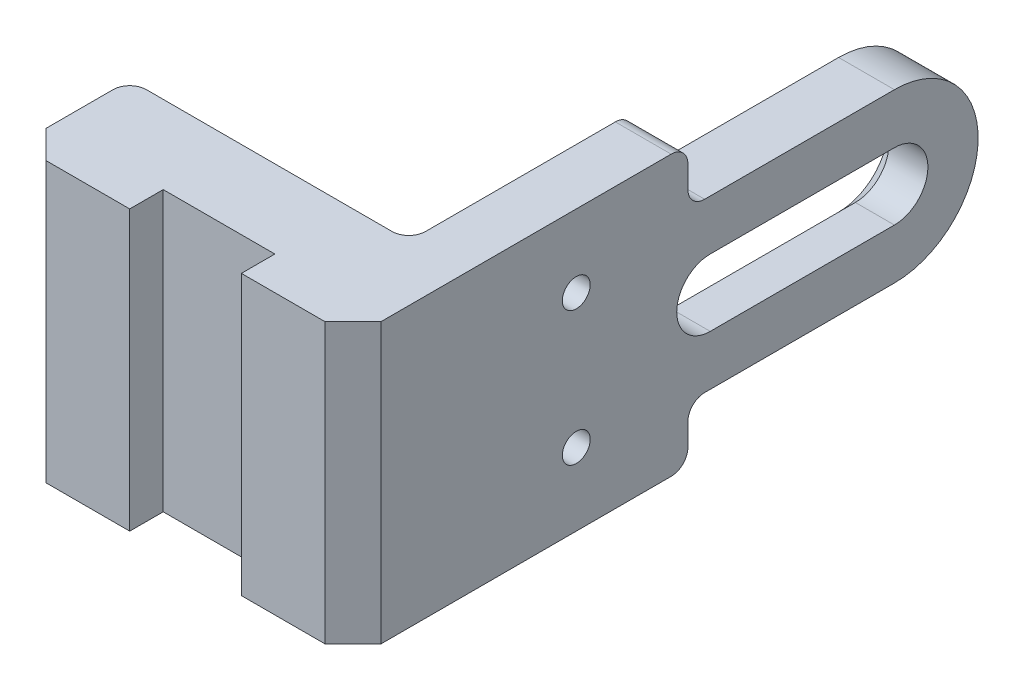
ISO-10303-21;
HEADER;
FILE_DESCRIPTION(('STEP AP214'),'2;1');
FILE_NAME('part.step','',(''),(''),'','','');
FILE_SCHEMA(('AUTOMOTIVE_DESIGN { 1 0 10303 214 1 1 1 1 }'));
ENDSEC;
DATA;
#1=APPLICATION_CONTEXT('core data for automotive mechanical design processes');
#2=APPLICATION_PROTOCOL_DEFINITION('international standard','automotive_design',2000,#1);
#3=PRODUCT_CONTEXT('',#1,'mechanical');
#4=PRODUCT('Part','Part','',(#3));
#5=PRODUCT_RELATED_PRODUCT_CATEGORY('part','',(#4));
#6=PRODUCT_DEFINITION_FORMATION('','',#4);
#7=PRODUCT_DEFINITION_CONTEXT('part definition',#1,'design');
#8=PRODUCT_DEFINITION('design','',#6,#7);
#9=PRODUCT_DEFINITION_SHAPE('','',#8);
#10=(LENGTH_UNIT() NAMED_UNIT(*) SI_UNIT(.MILLI.,.METRE.));
#11=(NAMED_UNIT(*) PLANE_ANGLE_UNIT() SI_UNIT($,.RADIAN.));
#12=(NAMED_UNIT(*) SI_UNIT($,.STERADIAN.) SOLID_ANGLE_UNIT());
#13=UNCERTAINTY_MEASURE_WITH_UNIT(LENGTH_MEASURE(1.E-05),#10,'distance_accuracy_value','');
#14=(GEOMETRIC_REPRESENTATION_CONTEXT(3) GLOBAL_UNCERTAINTY_ASSIGNED_CONTEXT((#13)) GLOBAL_UNIT_ASSIGNED_CONTEXT((#10,
#11,#12)) REPRESENTATION_CONTEXT('',''));
#15=CARTESIAN_POINT('',(0.,0.,0.));
#16=DIRECTION('',(0.,0.,1.));
#17=DIRECTION('',(1.,0.,0.));
#18=AXIS2_PLACEMENT_3D('',#15,#16,#17);
#19=CARTESIAN_POINT('',(0.,25.,0.));
#20=DIRECTION('',(0.,0.,1.));
#21=DIRECTION('',(1.,0.,0.));
#22=AXIS2_PLACEMENT_3D('',#19,#20,#21);
#23=PLANE('',#22);
#24=DIRECTION('',(-1.,0.,0.));
#25=VECTOR('',#24,1.);
#26=CARTESIAN_POINT('',(0.,0.,0.));
#27=LINE('',#26,#25);
#28=CARTESIAN_POINT('',(-2.50000000000002,0.,0.));
#29=VERTEX_POINT('',#28);
#30=CARTESIAN_POINT('',(-10.,0.,0.));
#31=VERTEX_POINT('',#30);
#32=EDGE_CURVE('E261',#29,#31,#27,.T.);
#33=ORIENTED_EDGE('',*,*,#32,.F.);
#34=DIRECTION('',(0.,1.,0.));
#35=VECTOR('',#34,1.);
#36=CARTESIAN_POINT('',(-2.50000000000002,25.,0.));
#37=LINE('',#36,#35);
#38=CARTESIAN_POINT('',(-2.50000000000002,25.,0.));
#39=VERTEX_POINT('',#38);
#40=EDGE_CURVE('E421',#29,#39,#37,.T.);
#41=ORIENTED_EDGE('',*,*,#40,.T.);
#42=DIRECTION('',(-1.,0.,0.));
#43=VECTOR('',#42,1.);
#44=CARTESIAN_POINT('',(0.,25.,0.));
#45=LINE('',#44,#43);
#46=CARTESIAN_POINT('',(-10.,25.,0.));
#47=VERTEX_POINT('',#46);
#48=EDGE_CURVE('E344',#39,#47,#45,.T.);
#49=ORIENTED_EDGE('',*,*,#48,.T.);
#50=DIRECTION('',(0.,1.,0.));
#51=VECTOR('',#50,1.);
#52=CARTESIAN_POINT('',(-10.,0.,0.));
#53=LINE('',#52,#51);
#54=EDGE_CURVE('E256',#31,#47,#53,.T.);
#55=ORIENTED_EDGE('',*,*,#54,.F.);
#56=EDGE_LOOP('',(#33,#41,#49,#55));
#57=FACE_BOUND('',#56,.T.);
#58=ADVANCED_FACE('F49',(#57),#23,.T.);
#59=CARTESIAN_POINT('',(0.,25.,0.));
#60=DIRECTION('',(0.,-1.,0.));
#61=DIRECTION('',(0.,0.,-1.));
#62=AXIS2_PLACEMENT_3D('',#59,#60,#61);
#63=PLANE('',#62);
#64=DIRECTION('',(-1.,0.,0.));
#65=VECTOR('',#64,1.);
#66=CARTESIAN_POINT('',(-5.,25.,-10.));
#67=LINE('',#66,#65);
#68=CARTESIAN_POINT('',(-6.5,25.,-10.));
#69=VERTEX_POINT('',#68);
#70=CARTESIAN_POINT('',(-28.5,25.,-10.));
#71=VERTEX_POINT('',#70);
#72=EDGE_CURVE('E350',#69,#71,#67,.T.);
#73=ORIENTED_EDGE('',*,*,#72,.T.);
#74=CARTESIAN_POINT('',(-28.5,25.,-8.5));
#75=DIRECTION('',(0.,-1.,0.));
#76=DIRECTION('',(0.,0.,-1.));
#77=AXIS2_PLACEMENT_3D('',#74,#75,#76);
#78=CIRCLE('',#77,1.5);
#79=CARTESIAN_POINT('',(-30.,25.,-8.5));
#80=VERTEX_POINT('',#79);
#81=EDGE_CURVE('E442',#71,#80,#78,.F.);
#82=ORIENTED_EDGE('',*,*,#81,.T.);
#83=DIRECTION('',(0.,0.,-1.));
#84=VECTOR('',#83,1.);
#85=CARTESIAN_POINT('',(-30.,25.,0.));
#86=LINE('',#85,#84);
#87=CARTESIAN_POINT('',(-30.,25.,-2.50000000000001));
#88=VERTEX_POINT('',#87);
#89=EDGE_CURVE('E346',#88,#80,#86,.T.);
#90=ORIENTED_EDGE('',*,*,#89,.F.);
#91=DIRECTION('',(-0.707106781186546,0.,-0.707106781186549));
#92=VECTOR('',#91,1.);
#93=CARTESIAN_POINT('',(-27.5,25.,0.));
#94=LINE('',#93,#92);
#95=CARTESIAN_POINT('',(-27.5,25.,0.));
#96=VERTEX_POINT('',#95);
#97=EDGE_CURVE('E423',#88,#96,#94,.F.);
#98=ORIENTED_EDGE('',*,*,#97,.T.);
#99=CARTESIAN_POINT('',(-20.,25.,0.));
#100=VERTEX_POINT('',#99);
#101=EDGE_CURVE('E347',#100,#96,#45,.T.);
#102=ORIENTED_EDGE('',*,*,#101,.F.);
#103=DIRECTION('',(0.,0.,1.));
#104=VECTOR('',#103,1.);
#105=CARTESIAN_POINT('',(-20.,25.,-3.));
#106=LINE('',#105,#104);
#107=CARTESIAN_POINT('',(-20.,25.,-3.));
#108=VERTEX_POINT('',#107);
#109=EDGE_CURVE('E246',#108,#100,#106,.T.);
#110=ORIENTED_EDGE('',*,*,#109,.F.);
#111=DIRECTION('',(1.,0.,0.));
#112=VECTOR('',#111,1.);
#113=CARTESIAN_POINT('',(-20.,25.,-3.));
#114=LINE('',#113,#112);
#115=CARTESIAN_POINT('',(-10.,25.,-3.));
#116=VERTEX_POINT('',#115);
#117=EDGE_CURVE('E266',#108,#116,#114,.T.);
#118=ORIENTED_EDGE('',*,*,#117,.T.);
#119=DIRECTION('',(0.,0.,1.));
#120=VECTOR('',#119,1.);
#121=CARTESIAN_POINT('',(-10.,25.,-3.));
#122=LINE('',#121,#120);
#123=EDGE_CURVE('E254',#116,#47,#122,.T.);
#124=ORIENTED_EDGE('',*,*,#123,.T.);
#125=ORIENTED_EDGE('',*,*,#48,.F.);
#126=DIRECTION('',(0.707106781186549,0.,-0.707106781186546));
#127=VECTOR('',#126,1.);
#128=CARTESIAN_POINT('',(0.,25.,-2.50000000000001));
#129=LINE('',#128,#127);
#130=CARTESIAN_POINT('',(0.,25.,-2.50000000000001));
#131=VERTEX_POINT('',#130);
#132=EDGE_CURVE('E425',#39,#131,#129,.T.);
#133=ORIENTED_EDGE('',*,*,#132,.T.);
#134=DIRECTION('',(0.,0.,-1.));
#135=VECTOR('',#134,1.);
#136=CARTESIAN_POINT('',(0.,25.,0.));
#137=LINE('',#136,#135);
#138=CARTESIAN_POINT('',(0.,25.,-28.5));
#139=VERTEX_POINT('',#138);
#140=EDGE_CURVE('E355',#131,#139,#137,.T.);
#141=ORIENTED_EDGE('',*,*,#140,.T.);
#142=DIRECTION('',(-1.,0.,0.));
#143=VECTOR('',#142,1.);
#144=CARTESIAN_POINT('',(0.,25.,-28.5));
#145=LINE('',#144,#143);
#146=CARTESIAN_POINT('',(-5.,25.,-28.5));
#147=VERTEX_POINT('',#146);
#148=EDGE_CURVE('E403',#139,#147,#145,.T.);
#149=ORIENTED_EDGE('',*,*,#148,.T.);
#150=DIRECTION('',(0.,0.,-1.));
#151=VECTOR('',#150,1.);
#152=CARTESIAN_POINT('',(-5.,25.,-10.));
#153=LINE('',#152,#151);
#154=CARTESIAN_POINT('',(-5.,25.,-11.5));
#155=VERTEX_POINT('',#154);
#156=EDGE_CURVE('E353',#155,#147,#153,.T.);
#157=ORIENTED_EDGE('',*,*,#156,.F.);
#158=CARTESIAN_POINT('',(-6.5,25.,-11.5));
#159=DIRECTION('',(0.,-1.,0.));
#160=DIRECTION('',(0.,0.,-1.));
#161=AXIS2_PLACEMENT_3D('',#158,#159,#160);
#162=CIRCLE('',#161,1.5);
#163=EDGE_CURVE('E448',#155,#69,#162,.T.);
#164=ORIENTED_EDGE('',*,*,#163,.T.);
#165=EDGE_LOOP('',(#73,#82,#90,#98,#102,#110,#118,#124,#125,#133,#141,#149,#157,#164));
#166=FACE_BOUND('',#165,.T.);
#167=ADVANCED_FACE('F516',(#166),#63,.F.);
#168=CARTESIAN_POINT('',(0.,0.,0.));
#169=DIRECTION('',(0.,-1.,0.));
#170=DIRECTION('',(0.,0.,-1.));
#171=AXIS2_PLACEMENT_3D('',#168,#169,#170);
#172=PLANE('',#171);
#173=DIRECTION('',(0.,0.,-1.));
#174=VECTOR('',#173,1.);
#175=CARTESIAN_POINT('',(-30.,0.,0.));
#176=LINE('',#175,#174);
#177=CARTESIAN_POINT('',(-30.,0.,-2.50000000000001));
#178=VERTEX_POINT('',#177);
#179=CARTESIAN_POINT('',(-30.,0.,-8.5));
#180=VERTEX_POINT('',#179);
#181=EDGE_CURVE('E359',#178,#180,#176,.T.);
#182=ORIENTED_EDGE('',*,*,#181,.T.);
#183=CARTESIAN_POINT('',(-28.5,0.,-8.5));
#184=DIRECTION('',(0.,-1.,0.));
#185=DIRECTION('',(0.,0.,-1.));
#186=AXIS2_PLACEMENT_3D('',#183,#184,#185);
#187=CIRCLE('',#186,1.5);
#188=CARTESIAN_POINT('',(-28.5,0.,-10.));
#189=VERTEX_POINT('',#188);
#190=EDGE_CURVE('E435',#180,#189,#187,.T.);
#191=ORIENTED_EDGE('',*,*,#190,.T.);
#192=DIRECTION('',(-1.,0.,0.));
#193=VECTOR('',#192,1.);
#194=CARTESIAN_POINT('',(-5.,0.,-10.));
#195=LINE('',#194,#193);
#196=CARTESIAN_POINT('',(-6.5,0.,-10.));
#197=VERTEX_POINT('',#196);
#198=EDGE_CURVE('E361',#197,#189,#195,.T.);
#199=ORIENTED_EDGE('',*,*,#198,.F.);
#200=CARTESIAN_POINT('',(-6.5,0.,-11.5));
#201=DIRECTION('',(0.,-1.,0.));
#202=DIRECTION('',(0.,0.,-1.));
#203=AXIS2_PLACEMENT_3D('',#200,#201,#202);
#204=CIRCLE('',#203,1.5);
#205=CARTESIAN_POINT('',(-5.,0.,-11.5));
#206=VERTEX_POINT('',#205);
#207=EDGE_CURVE('E446',#197,#206,#204,.F.);
#208=ORIENTED_EDGE('',*,*,#207,.T.);
#209=DIRECTION('',(0.,0.,-1.));
#210=VECTOR('',#209,1.);
#211=CARTESIAN_POINT('',(-5.,0.,-10.));
#212=LINE('',#211,#210);
#213=CARTESIAN_POINT('',(-5.,0.,-28.5));
#214=VERTEX_POINT('',#213);
#215=EDGE_CURVE('E364',#206,#214,#212,.T.);
#216=ORIENTED_EDGE('',*,*,#215,.T.);
#217=DIRECTION('',(-1.,0.,0.));
#218=VECTOR('',#217,1.);
#219=CARTESIAN_POINT('',(0.,0.,-28.5));
#220=LINE('',#219,#218);
#221=CARTESIAN_POINT('',(0.,0.,-28.5));
#222=VERTEX_POINT('',#221);
#223=EDGE_CURVE('E395',#214,#222,#220,.F.);
#224=ORIENTED_EDGE('',*,*,#223,.T.);
#225=DIRECTION('',(0.,0.,-1.));
#226=VECTOR('',#225,1.);
#227=CARTESIAN_POINT('',(0.,0.,0.));
#228=LINE('',#227,#226);
#229=CARTESIAN_POINT('',(0.,0.,-2.50000000000001));
#230=VERTEX_POINT('',#229);
#231=EDGE_CURVE('E366',#230,#222,#228,.T.);
#232=ORIENTED_EDGE('',*,*,#231,.F.);
#233=DIRECTION('',(-0.707106781186549,0.,0.707106781186546));
#234=VECTOR('',#233,1.);
#235=CARTESIAN_POINT('',(-1.25,0.,-1.25000000000001));
#236=LINE('',#235,#234);
#237=EDGE_CURVE('E419',#230,#29,#236,.T.);
#238=ORIENTED_EDGE('',*,*,#237,.T.);
#239=ORIENTED_EDGE('',*,*,#32,.T.);
#240=DIRECTION('',(0.,0.,1.));
#241=VECTOR('',#240,1.);
#242=CARTESIAN_POINT('',(-10.,0.,-3.));
#243=LINE('',#242,#241);
#244=CARTESIAN_POINT('',(-10.,0.,-3.));
#245=VERTEX_POINT('',#244);
#246=EDGE_CURVE('E245',#245,#31,#243,.T.);
#247=ORIENTED_EDGE('',*,*,#246,.F.);
#248=DIRECTION('',(1.,0.,0.));
#249=VECTOR('',#248,1.);
#250=CARTESIAN_POINT('',(-20.,0.,-3.));
#251=LINE('',#250,#249);
#252=CARTESIAN_POINT('',(-20.,0.,-3.));
#253=VERTEX_POINT('',#252);
#254=EDGE_CURVE('E234',#253,#245,#251,.T.);
#255=ORIENTED_EDGE('',*,*,#254,.F.);
#256=DIRECTION('',(0.,0.,1.));
#257=VECTOR('',#256,1.);
#258=CARTESIAN_POINT('',(-20.,0.,-3.));
#259=LINE('',#258,#257);
#260=CARTESIAN_POINT('',(-20.,0.,0.));
#261=VERTEX_POINT('',#260);
#262=EDGE_CURVE('E262',#253,#261,#259,.T.);
#263=ORIENTED_EDGE('',*,*,#262,.T.);
#264=CARTESIAN_POINT('',(-27.5,0.,0.));
#265=VERTEX_POINT('',#264);
#266=EDGE_CURVE('E343',#261,#265,#27,.T.);
#267=ORIENTED_EDGE('',*,*,#266,.T.);
#268=DIRECTION('',(0.707106781186546,0.,0.707106781186549));
#269=VECTOR('',#268,1.);
#270=CARTESIAN_POINT('',(-13.7500000000001,0.,13.75));
#271=LINE('',#270,#269);
#272=EDGE_CURVE('E417',#265,#178,#271,.F.);
#273=ORIENTED_EDGE('',*,*,#272,.T.);
#274=EDGE_LOOP('',(#182,#191,#199,#208,#216,#224,#232,#238,#239,#247,#255,#263,#267,#273));
#275=FACE_BOUND('',#274,.T.);
#276=ADVANCED_FACE('F259',(#275),#172,.T.);
#277=CARTESIAN_POINT('',(0.,25.,0.));
#278=DIRECTION('',(-1.,0.,0.));
#279=DIRECTION('',(0.,0.,1.));
#280=AXIS2_PLACEMENT_3D('',#277,#278,#279);
#281=PLANE('',#280);
#282=CARTESIAN_POINT('',(0.,18.5,-20.));
#283=DIRECTION('',(1.,0.,0.));
#284=DIRECTION('',(0.,0.,-1.));
#285=AXIS2_PLACEMENT_3D('',#282,#283,#284);
#286=CIRCLE('',#285,1.25);
#287=CARTESIAN_POINT('',(0.,18.5,-21.25));
#288=VERTEX_POINT('',#287);
#289=EDGE_CURVE('E293',#288,#288,#286,.T.);
#290=ORIENTED_EDGE('',*,*,#289,.F.);
#291=EDGE_LOOP('',(#290));
#292=FACE_BOUND('',#291,.T.);
#293=CARTESIAN_POINT('',(0.,6.5,-20.));
#294=DIRECTION('',(1.,0.,0.));
#295=DIRECTION('',(0.,0.,-1.));
#296=AXIS2_PLACEMENT_3D('',#293,#294,#295);
#297=CIRCLE('',#296,1.25);
#298=CARTESIAN_POINT('',(0.,6.5,-21.25));
#299=VERTEX_POINT('',#298);
#300=EDGE_CURVE('E283',#299,#299,#297,.T.);
#301=ORIENTED_EDGE('',*,*,#300,.F.);
#302=EDGE_LOOP('',(#301));
#303=FACE_BOUND('',#302,.T.);
#304=DIRECTION('',(0.,0.,-1.));
#305=VECTOR('',#304,1.);
#306=CARTESIAN_POINT('',(0.,9.5,-32.));
#307=LINE('',#306,#305);
#308=CARTESIAN_POINT('',(0.,9.5,-32.));
#309=VERTEX_POINT('',#308);
#310=CARTESIAN_POINT('',(0.,9.5,-48.5));
#311=VERTEX_POINT('',#310);
#312=EDGE_CURVE('E301',#309,#311,#307,.T.);
#313=ORIENTED_EDGE('',*,*,#312,.F.);
#314=CARTESIAN_POINT('',(0.,12.5,-32.));
#315=DIRECTION('',(1.,0.,0.));
#316=DIRECTION('',(0.,0.,-1.));
#317=AXIS2_PLACEMENT_3D('',#314,#315,#316);
#318=CIRCLE('',#317,3.);
#319=CARTESIAN_POINT('',(0.,15.5,-32.));
#320=VERTEX_POINT('',#319);
#321=EDGE_CURVE('E296',#320,#309,#318,.T.);
#322=ORIENTED_EDGE('',*,*,#321,.F.);
#323=DIRECTION('',(0.,0.,-1.));
#324=VECTOR('',#323,1.);
#325=CARTESIAN_POINT('',(0.,15.5,-32.));
#326=LINE('',#325,#324);
#327=CARTESIAN_POINT('',(0.,15.5,-48.5));
#328=VERTEX_POINT('',#327);
#329=EDGE_CURVE('E307',#320,#328,#326,.T.);
#330=ORIENTED_EDGE('',*,*,#329,.T.);
#331=CARTESIAN_POINT('',(0.,12.5,-48.5));
#332=DIRECTION('',(1.,0.,0.));
#333=DIRECTION('',(0.,0.,-1.));
#334=AXIS2_PLACEMENT_3D('',#331,#332,#333);
#335=CIRCLE('',#334,3.);
#336=EDGE_CURVE('E304',#311,#328,#335,.T.);
#337=ORIENTED_EDGE('',*,*,#336,.F.);
#338=EDGE_LOOP('',(#313,#322,#330,#337));
#339=FACE_BOUND('',#338,.T.);
#340=ORIENTED_EDGE('',*,*,#140,.F.);
#341=DIRECTION('',(0.,-1.,0.));
#342=VECTOR('',#341,1.);
#343=CARTESIAN_POINT('',(0.,0.,-2.50000000000001));
#344=LINE('',#343,#342);
#345=EDGE_CURVE('E414',#131,#230,#344,.T.);
#346=ORIENTED_EDGE('',*,*,#345,.T.);
#347=ORIENTED_EDGE('',*,*,#231,.T.);
#348=CARTESIAN_POINT('',(0.,1.5,-28.5));
#349=DIRECTION('',(-1.,0.,0.));
#350=DIRECTION('',(0.,0.,1.));
#351=AXIS2_PLACEMENT_3D('',#348,#349,#350);
#352=CIRCLE('',#351,1.5);
#353=CARTESIAN_POINT('',(0.,1.5,-30.));
#354=VERTEX_POINT('',#353);
#355=EDGE_CURVE('E401',#222,#354,#352,.F.);
#356=ORIENTED_EDGE('',*,*,#355,.T.);
#357=DIRECTION('',(0.,-1.,0.));
#358=VECTOR('',#357,1.);
#359=CARTESIAN_POINT('',(0.,0.,-30.));
#360=LINE('',#359,#358);
#361=CARTESIAN_POINT('',(0.,3.5,-30.));
#362=VERTEX_POINT('',#361);
#363=EDGE_CURVE('E320',#362,#354,#360,.T.);
#364=ORIENTED_EDGE('',*,*,#363,.F.);
#365=CARTESIAN_POINT('',(0.,3.5,-31.5));
#366=DIRECTION('',(-1.,0.,0.));
#367=DIRECTION('',(0.,0.,1.));
#368=AXIS2_PLACEMENT_3D('',#365,#366,#367);
#369=CIRCLE('',#368,1.5);
#370=CARTESIAN_POINT('',(0.,5.,-31.5));
#371=VERTEX_POINT('',#370);
#372=EDGE_CURVE('E410',#362,#371,#369,.T.);
#373=ORIENTED_EDGE('',*,*,#372,.T.);
#374=DIRECTION('',(0.,0.,-1.));
#375=VECTOR('',#374,1.);
#376=CARTESIAN_POINT('',(0.,5.,0.));
#377=LINE('',#376,#375);
#378=CARTESIAN_POINT('',(0.,5.,-48.5));
#379=VERTEX_POINT('',#378);
#380=EDGE_CURVE('E313',#371,#379,#377,.T.);
#381=ORIENTED_EDGE('',*,*,#380,.T.);
#382=CARTESIAN_POINT('',(0.,12.5,-48.5));
#383=DIRECTION('',(1.,0.,0.));
#384=DIRECTION('',(0.,0.,-1.));
#385=AXIS2_PLACEMENT_3D('',#382,#383,#384);
#386=CIRCLE('',#385,7.5);
#387=CARTESIAN_POINT('',(0.,20.,-48.5));
#388=VERTEX_POINT('',#387);
#389=EDGE_CURVE('E334',#379,#388,#386,.T.);
#390=ORIENTED_EDGE('',*,*,#389,.T.);
#391=DIRECTION('',(0.,0.,-1.));
#392=VECTOR('',#391,1.);
#393=CARTESIAN_POINT('',(0.,20.,0.));
#394=LINE('',#393,#392);
#395=CARTESIAN_POINT('',(0.,20.,-31.5));
#396=VERTEX_POINT('',#395);
#397=EDGE_CURVE('E332',#396,#388,#394,.T.);
#398=ORIENTED_EDGE('',*,*,#397,.F.);
#399=CARTESIAN_POINT('',(0.,21.5,-31.5));
#400=DIRECTION('',(-1.,0.,0.));
#401=DIRECTION('',(0.,0.,1.));
#402=AXIS2_PLACEMENT_3D('',#399,#400,#401);
#403=CIRCLE('',#402,1.5);
#404=CARTESIAN_POINT('',(0.,21.5,-30.));
#405=VERTEX_POINT('',#404);
#406=EDGE_CURVE('E406',#396,#405,#403,.T.);
#407=ORIENTED_EDGE('',*,*,#406,.T.);
#408=DIRECTION('',(0.,-1.,0.));
#409=VECTOR('',#408,1.);
#410=CARTESIAN_POINT('',(0.,0.,-30.));
#411=LINE('',#410,#409);
#412=CARTESIAN_POINT('',(0.,23.5,-30.));
#413=VERTEX_POINT('',#412);
#414=EDGE_CURVE('E329',#413,#405,#411,.T.);
#415=ORIENTED_EDGE('',*,*,#414,.F.);
#416=CARTESIAN_POINT('',(0.,23.5,-28.5));
#417=DIRECTION('',(-1.,0.,0.));
#418=DIRECTION('',(0.,0.,1.));
#419=AXIS2_PLACEMENT_3D('',#416,#417,#418);
#420=CIRCLE('',#419,1.5);
#421=EDGE_CURVE('E398',#413,#139,#420,.F.);
#422=ORIENTED_EDGE('',*,*,#421,.T.);
#423=EDGE_LOOP('',(#340,#346,#347,#356,#364,#373,#381,#390,#398,#407,#415,#422));
#424=FACE_BOUND('',#423,.T.);
#425=ADVANCED_FACE('F500',(#292,#303,#339,#424),#281,.F.);
#426=CARTESIAN_POINT('',(-5.,25.,-10.));
#427=DIRECTION('',(-1.,0.,0.));
#428=DIRECTION('',(0.,0.,1.));
#429=AXIS2_PLACEMENT_3D('',#426,#427,#428);
#430=PLANE('',#429);
#431=CARTESIAN_POINT('',(-5.,12.5,-32.));
#432=DIRECTION('',(-1.,0.,0.));
#433=DIRECTION('',(0.,0.,1.));
#434=AXIS2_PLACEMENT_3D('',#431,#432,#433);
#435=CIRCLE('',#434,4.5);
#436=CARTESIAN_POINT('',(-5.,17.,-32.));
#437=VERTEX_POINT('',#436);
#438=CARTESIAN_POINT('',(-5.,8.,-32.));
#439=VERTEX_POINT('',#438);
#440=EDGE_CURVE('E455',#437,#439,#435,.F.);
#441=ORIENTED_EDGE('',*,*,#440,.T.);
#442=DIRECTION('',(0.,0.,-1.));
#443=VECTOR('',#442,1.);
#444=CARTESIAN_POINT('',(-5.,8.,-48.5));
#445=LINE('',#444,#443);
#446=CARTESIAN_POINT('',(-5.,8.,-48.5));
#447=VERTEX_POINT('',#446);
#448=EDGE_CURVE('E459',#439,#447,#445,.T.);
#449=ORIENTED_EDGE('',*,*,#448,.T.);
#450=CARTESIAN_POINT('',(-5.,12.5,-48.5));
#451=DIRECTION('',(-1.,0.,0.));
#452=DIRECTION('',(0.,0.,1.));
#453=AXIS2_PLACEMENT_3D('',#450,#451,#452);
#454=CIRCLE('',#453,4.5);
#455=CARTESIAN_POINT('',(-5.,17.,-48.5));
#456=VERTEX_POINT('',#455);
#457=EDGE_CURVE('E457',#447,#456,#454,.F.);
#458=ORIENTED_EDGE('',*,*,#457,.T.);
#459=DIRECTION('',(0.,0.,1.));
#460=VECTOR('',#459,1.);
#461=CARTESIAN_POINT('',(-5.,17.,-10.));
#462=LINE('',#461,#460);
#463=EDGE_CURVE('E453',#456,#437,#462,.T.);
#464=ORIENTED_EDGE('',*,*,#463,.T.);
#465=EDGE_LOOP('',(#441,#449,#458,#464));
#466=FACE_BOUND('',#465,.T.);
#467=CARTESIAN_POINT('',(-5.,18.5,-20.));
#468=DIRECTION('',(1.,0.,0.));
#469=DIRECTION('',(0.,0.,-1.));
#470=AXIS2_PLACEMENT_3D('',#467,#468,#469);
#471=CIRCLE('',#470,3.);
#472=CARTESIAN_POINT('',(-5.,18.5,-23.));
#473=VERTEX_POINT('',#472);
#474=EDGE_CURVE('E280',#473,#473,#471,.T.);
#475=ORIENTED_EDGE('',*,*,#474,.T.);
#476=EDGE_LOOP('',(#475));
#477=FACE_BOUND('',#476,.T.);
#478=CARTESIAN_POINT('',(-5.,6.5,-20.));
#479=DIRECTION('',(1.,0.,0.));
#480=DIRECTION('',(0.,0.,-1.));
#481=AXIS2_PLACEMENT_3D('',#478,#479,#480);
#482=CIRCLE('',#481,3.);
#483=CARTESIAN_POINT('',(-5.,6.5,-23.));
#484=VERTEX_POINT('',#483);
#485=EDGE_CURVE('E279',#484,#484,#482,.T.);
#486=ORIENTED_EDGE('',*,*,#485,.T.);
#487=EDGE_LOOP('',(#486));
#488=FACE_BOUND('',#487,.T.);
#489=ORIENTED_EDGE('',*,*,#215,.F.);
#490=DIRECTION('',(0.,-1.,0.));
#491=VECTOR('',#490,1.);
#492=CARTESIAN_POINT('',(-5.,25.,-11.5));
#493=LINE('',#492,#491);
#494=EDGE_CURVE('E444',#206,#155,#493,.F.);
#495=ORIENTED_EDGE('',*,*,#494,.T.);
#496=ORIENTED_EDGE('',*,*,#156,.T.);
#497=CARTESIAN_POINT('',(-5.,23.5,-28.5));
#498=DIRECTION('',(-1.,0.,0.));
#499=DIRECTION('',(0.,0.,1.));
#500=AXIS2_PLACEMENT_3D('',#497,#498,#499);
#501=CIRCLE('',#500,1.5);
#502=CARTESIAN_POINT('',(-5.,23.5,-30.));
#503=VERTEX_POINT('',#502);
#504=EDGE_CURVE('E390',#147,#503,#501,.T.);
#505=ORIENTED_EDGE('',*,*,#504,.T.);
#506=DIRECTION('',(0.,1.,0.));
#507=VECTOR('',#506,1.);
#508=CARTESIAN_POINT('',(-5.,25.,-30.));
#509=LINE('',#508,#507);
#510=CARTESIAN_POINT('',(-5.,21.5,-30.));
#511=VERTEX_POINT('',#510);
#512=EDGE_CURVE('E340',#511,#503,#509,.T.);
#513=ORIENTED_EDGE('',*,*,#512,.F.);
#514=CARTESIAN_POINT('',(-5.,21.5,-31.5));
#515=DIRECTION('',(-1.,0.,0.));
#516=DIRECTION('',(0.,0.,1.));
#517=AXIS2_PLACEMENT_3D('',#514,#515,#516);
#518=CIRCLE('',#517,1.5);
#519=CARTESIAN_POINT('',(-5.,20.,-31.5));
#520=VERTEX_POINT('',#519);
#521=EDGE_CURVE('E408',#511,#520,#518,.F.);
#522=ORIENTED_EDGE('',*,*,#521,.T.);
#523=DIRECTION('',(0.,0.,1.));
#524=VECTOR('',#523,1.);
#525=CARTESIAN_POINT('',(-5.,20.,-10.));
#526=LINE('',#525,#524);
#527=CARTESIAN_POINT('',(-5.,20.,-48.5));
#528=VERTEX_POINT('',#527);
#529=EDGE_CURVE('E357',#528,#520,#526,.T.);
#530=ORIENTED_EDGE('',*,*,#529,.F.);
#531=CARTESIAN_POINT('',(-5.,12.5,-48.5));
#532=DIRECTION('',(-1.,0.,0.));
#533=DIRECTION('',(0.,0.,1.));
#534=AXIS2_PLACEMENT_3D('',#531,#532,#533);
#535=CIRCLE('',#534,7.5);
#536=CARTESIAN_POINT('',(-5.,5.,-48.5));
#537=VERTEX_POINT('',#536);
#538=EDGE_CURVE('E370',#528,#537,#535,.T.);
#539=ORIENTED_EDGE('',*,*,#538,.T.);
#540=DIRECTION('',(0.,0.,1.));
#541=VECTOR('',#540,1.);
#542=CARTESIAN_POINT('',(-5.,5.,-10.));
#543=LINE('',#542,#541);
#544=CARTESIAN_POINT('',(-5.,5.,-31.5));
#545=VERTEX_POINT('',#544);
#546=EDGE_CURVE('E372',#537,#545,#543,.T.);
#547=ORIENTED_EDGE('',*,*,#546,.T.);
#548=CARTESIAN_POINT('',(-5.,3.5,-31.5));
#549=DIRECTION('',(-1.,0.,0.));
#550=DIRECTION('',(0.,0.,1.));
#551=AXIS2_PLACEMENT_3D('',#548,#549,#550);
#552=CIRCLE('',#551,1.5);
#553=CARTESIAN_POINT('',(-5.,3.5,-30.));
#554=VERTEX_POINT('',#553);
#555=EDGE_CURVE('E412',#545,#554,#552,.F.);
#556=ORIENTED_EDGE('',*,*,#555,.T.);
#557=DIRECTION('',(0.,1.,0.));
#558=VECTOR('',#557,1.);
#559=CARTESIAN_POINT('',(-5.,25.,-30.));
#560=LINE('',#559,#558);
#561=CARTESIAN_POINT('',(-5.,1.5,-30.));
#562=VERTEX_POINT('',#561);
#563=EDGE_CURVE('E326',#562,#554,#560,.T.);
#564=ORIENTED_EDGE('',*,*,#563,.F.);
#565=CARTESIAN_POINT('',(-5.,1.5,-28.5));
#566=DIRECTION('',(-1.,0.,0.));
#567=DIRECTION('',(0.,0.,1.));
#568=AXIS2_PLACEMENT_3D('',#565,#566,#567);
#569=CIRCLE('',#568,1.5);
#570=EDGE_CURVE('E392',#562,#214,#569,.T.);
#571=ORIENTED_EDGE('',*,*,#570,.T.);
#572=EDGE_LOOP('',(#489,#495,#496,#505,#513,#522,#530,#539,#547,#556,#564,#571));
#573=FACE_BOUND('',#572,.T.);
#574=ADVANCED_FACE('F483',(#466,#477,#488,#573),#430,.T.);
#575=ORIENTED_EDGE('',*,*,#101,.T.);
#576=DIRECTION('',(0.,-1.,0.));
#577=VECTOR('',#576,1.);
#578=CARTESIAN_POINT('',(-27.5,25.,0.));
#579=LINE('',#578,#577);
#580=EDGE_CURVE('E427',#96,#265,#579,.T.);
#581=ORIENTED_EDGE('',*,*,#580,.T.);
#582=ORIENTED_EDGE('',*,*,#266,.F.);
#583=DIRECTION('',(0.,1.,0.));
#584=VECTOR('',#583,1.);
#585=CARTESIAN_POINT('',(-20.,0.,0.));
#586=LINE('',#585,#584);
#587=EDGE_CURVE('E271',#261,#100,#586,.T.);
#588=ORIENTED_EDGE('',*,*,#587,.T.);
#589=EDGE_LOOP('',(#575,#581,#582,#588));
#590=FACE_BOUND('',#589,.T.);
#591=ADVANCED_FACE('F519',(#590),#23,.T.);
#592=CARTESIAN_POINT('',(-5.,25.,-10.));
#593=DIRECTION('',(0.,0.,1.));
#594=DIRECTION('',(1.,0.,0.));
#595=AXIS2_PLACEMENT_3D('',#592,#593,#594);
#596=PLANE('',#595);
#597=ORIENTED_EDGE('',*,*,#198,.T.);
#598=DIRECTION('',(0.,-1.,0.));
#599=VECTOR('',#598,1.);
#600=CARTESIAN_POINT('',(-28.5,25.,-10.));
#601=LINE('',#600,#599);
#602=EDGE_CURVE('E440',#189,#71,#601,.F.);
#603=ORIENTED_EDGE('',*,*,#602,.T.);
#604=ORIENTED_EDGE('',*,*,#72,.F.);
#605=DIRECTION('',(0.,-1.,0.));
#606=VECTOR('',#605,1.);
#607=CARTESIAN_POINT('',(-6.5,25.,-10.));
#608=LINE('',#607,#606);
#609=EDGE_CURVE('E437',#69,#197,#608,.T.);
#610=ORIENTED_EDGE('',*,*,#609,.T.);
#611=EDGE_LOOP('',(#597,#603,#604,#610));
#612=FACE_BOUND('',#611,.T.);
#613=ADVANCED_FACE('F528',(#612),#596,.F.);
#614=CARTESIAN_POINT('',(-30.,25.,0.));
#615=DIRECTION('',(-1.,0.,0.));
#616=DIRECTION('',(0.,0.,1.));
#617=AXIS2_PLACEMENT_3D('',#614,#615,#616);
#618=PLANE('',#617);
#619=ORIENTED_EDGE('',*,*,#89,.T.);
#620=DIRECTION('',(0.,-1.,0.));
#621=VECTOR('',#620,1.);
#622=CARTESIAN_POINT('',(-30.,0.,-8.5));
#623=LINE('',#622,#621);
#624=EDGE_CURVE('E432',#80,#180,#623,.T.);
#625=ORIENTED_EDGE('',*,*,#624,.T.);
#626=ORIENTED_EDGE('',*,*,#181,.F.);
#627=DIRECTION('',(0.,1.,0.));
#628=VECTOR('',#627,1.);
#629=CARTESIAN_POINT('',(-30.,25.,-2.50000000000001));
#630=LINE('',#629,#628);
#631=EDGE_CURVE('E430',#178,#88,#630,.T.);
#632=ORIENTED_EDGE('',*,*,#631,.T.);
#633=EDGE_LOOP('',(#619,#625,#626,#632));
#634=FACE_BOUND('',#633,.T.);
#635=ADVANCED_FACE('F534',(#634),#618,.T.);
#636=CARTESIAN_POINT('',(-25.,12.5,-48.5));
#637=DIRECTION('',(1.,0.,0.));
#638=DIRECTION('',(0.,0.,-1.));
#639=AXIS2_PLACEMENT_3D('',#636,#637,#638);
#640=CYLINDRICAL_SURFACE('',#639,7.5);
#641=DIRECTION('',(1.,0.,0.));
#642=VECTOR('',#641,1.);
#643=CARTESIAN_POINT('',(-25.,20.,-48.5));
#644=LINE('',#643,#642);
#645=EDGE_CURVE('E337',#528,#388,#644,.T.);
#646=ORIENTED_EDGE('',*,*,#645,.T.);
#647=ORIENTED_EDGE('',*,*,#389,.F.);
#648=DIRECTION('',(1.,0.,0.));
#649=VECTOR('',#648,1.);
#650=CARTESIAN_POINT('',(-25.,5.,-48.5));
#651=LINE('',#650,#649);
#652=EDGE_CURVE('E323',#537,#379,#651,.T.);
#653=ORIENTED_EDGE('',*,*,#652,.F.);
#654=ORIENTED_EDGE('',*,*,#538,.F.);
#655=EDGE_LOOP('',(#646,#647,#653,#654));
#656=FACE_BOUND('',#655,.T.);
#657=ADVANCED_FACE('F635',(#656),#640,.T.);
#658=CARTESIAN_POINT('',(-25.,20.,0.));
#659=DIRECTION('',(0.,-1.,0.));
#660=DIRECTION('',(0.,0.,-1.));
#661=AXIS2_PLACEMENT_3D('',#658,#659,#660);
#662=PLANE('',#661);
#663=ORIENTED_EDGE('',*,*,#529,.T.);
#664=DIRECTION('',(1.,0.,0.));
#665=VECTOR('',#664,1.);
#666=CARTESIAN_POINT('',(0.,20.,-31.5));
#667=LINE('',#666,#665);
#668=EDGE_CURVE('E375',#520,#396,#667,.T.);
#669=ORIENTED_EDGE('',*,*,#668,.T.);
#670=ORIENTED_EDGE('',*,*,#397,.T.);
#671=ORIENTED_EDGE('',*,*,#645,.F.);
#672=EDGE_LOOP('',(#663,#669,#670,#671));
#673=FACE_BOUND('',#672,.T.);
#674=ADVANCED_FACE('F639',(#673),#662,.F.);
#675=CARTESIAN_POINT('',(-25.,0.,-30.));
#676=DIRECTION('',(0.,0.,1.));
#677=DIRECTION('',(1.,0.,0.));
#678=AXIS2_PLACEMENT_3D('',#675,#676,#677);
#679=PLANE('',#678);
#680=ORIENTED_EDGE('',*,*,#414,.T.);
#681=DIRECTION('',(1.,0.,0.));
#682=VECTOR('',#681,1.);
#683=CARTESIAN_POINT('',(-5.,21.5,-30.));
#684=LINE('',#683,#682);
#685=EDGE_CURVE('E380',#405,#511,#684,.F.);
#686=ORIENTED_EDGE('',*,*,#685,.T.);
#687=ORIENTED_EDGE('',*,*,#512,.T.);
#688=DIRECTION('',(-1.,0.,0.));
#689=VECTOR('',#688,1.);
#690=CARTESIAN_POINT('',(-25.,23.5,-30.));
#691=LINE('',#690,#689);
#692=EDGE_CURVE('E378',#503,#413,#691,.F.);
#693=ORIENTED_EDGE('',*,*,#692,.T.);
#694=EDGE_LOOP('',(#680,#686,#687,#693));
#695=FACE_BOUND('',#694,.T.);
#696=ADVANCED_FACE('F645',(#695),#679,.F.);
#697=CARTESIAN_POINT('',(-25.,0.,-30.));
#698=DIRECTION('',(0.,0.,1.));
#699=DIRECTION('',(1.,0.,0.));
#700=AXIS2_PLACEMENT_3D('',#697,#698,#699);
#701=PLANE('',#700);
#702=ORIENTED_EDGE('',*,*,#563,.T.);
#703=DIRECTION('',(1.,0.,0.));
#704=VECTOR('',#703,1.);
#705=CARTESIAN_POINT('',(-25.,3.5,-30.));
#706=LINE('',#705,#704);
#707=EDGE_CURVE('E385',#554,#362,#706,.T.);
#708=ORIENTED_EDGE('',*,*,#707,.T.);
#709=ORIENTED_EDGE('',*,*,#363,.T.);
#710=DIRECTION('',(-1.,0.,0.));
#711=VECTOR('',#710,1.);
#712=CARTESIAN_POINT('',(-5.,1.5,-30.));
#713=LINE('',#712,#711);
#714=EDGE_CURVE('E382',#354,#562,#713,.T.);
#715=ORIENTED_EDGE('',*,*,#714,.T.);
#716=EDGE_LOOP('',(#702,#708,#709,#715));
#717=FACE_BOUND('',#716,.T.);
#718=ADVANCED_FACE('F652',(#717),#701,.F.);
#719=CARTESIAN_POINT('',(-25.,5.,0.));
#720=DIRECTION('',(0.,-1.,0.));
#721=DIRECTION('',(0.,0.,-1.));
#722=AXIS2_PLACEMENT_3D('',#719,#720,#721);
#723=PLANE('',#722);
#724=ORIENTED_EDGE('',*,*,#380,.F.);
#725=DIRECTION('',(1.,0.,0.));
#726=VECTOR('',#725,1.);
#727=CARTESIAN_POINT('',(-25.,5.,-31.5));
#728=LINE('',#727,#726);
#729=EDGE_CURVE('E388',#371,#545,#728,.F.);
#730=ORIENTED_EDGE('',*,*,#729,.T.);
#731=ORIENTED_EDGE('',*,*,#546,.F.);
#732=ORIENTED_EDGE('',*,*,#652,.T.);
#733=EDGE_LOOP('',(#724,#730,#731,#732));
#734=FACE_BOUND('',#733,.T.);
#735=ADVANCED_FACE('F512',(#734),#723,.T.);
#736=CARTESIAN_POINT('',(-25.,12.5,-32.));
#737=DIRECTION('',(1.,0.,0.));
#738=DIRECTION('',(0.,0.,-1.));
#739=AXIS2_PLACEMENT_3D('',#736,#737,#738);
#740=CYLINDRICAL_SURFACE('',#739,3.);
#741=DIRECTION('',(1.,0.,0.));
#742=VECTOR('',#741,1.);
#743=CARTESIAN_POINT('',(-25.,9.5,-32.));
#744=LINE('',#743,#742);
#745=CARTESIAN_POINT('',(-3.49999999999999,9.5,-32.));
#746=VERTEX_POINT('',#745);
#747=EDGE_CURVE('E310',#746,#309,#744,.T.);
#748=ORIENTED_EDGE('',*,*,#747,.F.);
#749=CARTESIAN_POINT('',(-3.49999999999999,12.5,-32.));
#750=DIRECTION('',(-1.,0.,0.));
#751=DIRECTION('',(0.,0.,1.));
#752=AXIS2_PLACEMENT_3D('',#749,#750,#751);
#753=CIRCLE('',#752,3.);
#754=CARTESIAN_POINT('',(-3.49999999999999,15.5,-32.));
#755=VERTEX_POINT('',#754);
#756=EDGE_CURVE('E58',#746,#755,#753,.T.);
#757=ORIENTED_EDGE('',*,*,#756,.T.);
#758=DIRECTION('',(1.,0.,0.));
#759=VECTOR('',#758,1.);
#760=CARTESIAN_POINT('',(-25.,15.5,-32.));
#761=LINE('',#760,#759);
#762=EDGE_CURVE('E311',#755,#320,#761,.T.);
#763=ORIENTED_EDGE('',*,*,#762,.T.);
#764=ORIENTED_EDGE('',*,*,#321,.T.);
#765=EDGE_LOOP('',(#748,#757,#763,#764));
#766=FACE_BOUND('',#765,.T.);
#767=ADVANCED_FACE('F494',(#766),#740,.F.);
#768=CARTESIAN_POINT('',(-25.,15.5,-32.));
#769=DIRECTION('',(0.,-1.,0.));
#770=DIRECTION('',(0.,0.,-1.));
#771=AXIS2_PLACEMENT_3D('',#768,#769,#770);
#772=PLANE('',#771);
#773=ORIENTED_EDGE('',*,*,#762,.F.);
#774=DIRECTION('',(0.,0.,-1.));
#775=VECTOR('',#774,1.);
#776=CARTESIAN_POINT('',(-3.49999999999999,15.5,-32.));
#777=LINE('',#776,#775);
#778=CARTESIAN_POINT('',(-3.49999999999999,15.5,-48.5));
#779=VERTEX_POINT('',#778);
#780=EDGE_CURVE('E13',#755,#779,#777,.T.);
#781=ORIENTED_EDGE('',*,*,#780,.T.);
#782=DIRECTION('',(1.,0.,0.));
#783=VECTOR('',#782,1.);
#784=CARTESIAN_POINT('',(-25.,15.5,-48.5));
#785=LINE('',#784,#783);
#786=EDGE_CURVE('E314',#779,#328,#785,.T.);
#787=ORIENTED_EDGE('',*,*,#786,.T.);
#788=ORIENTED_EDGE('',*,*,#329,.F.);
#789=EDGE_LOOP('',(#773,#781,#787,#788));
#790=FACE_BOUND('',#789,.T.);
#791=ADVANCED_FACE('F504',(#790),#772,.T.);
#792=CARTESIAN_POINT('',(-25.,12.5,-48.5));
#793=DIRECTION('',(1.,0.,0.));
#794=DIRECTION('',(0.,0.,-1.));
#795=AXIS2_PLACEMENT_3D('',#792,#793,#794);
#796=CYLINDRICAL_SURFACE('',#795,3.);
#797=ORIENTED_EDGE('',*,*,#786,.F.);
#798=CARTESIAN_POINT('',(-3.49999999999999,12.5,-48.5));
#799=DIRECTION('',(-1.,0.,0.));
#800=DIRECTION('',(0.,0.,1.));
#801=AXIS2_PLACEMENT_3D('',#798,#799,#800);
#802=CIRCLE('',#801,3.);
#803=CARTESIAN_POINT('',(-3.49999999999999,9.5,-48.5));
#804=VERTEX_POINT('',#803);
#805=EDGE_CURVE('E462',#779,#804,#802,.T.);
#806=ORIENTED_EDGE('',*,*,#805,.T.);
#807=DIRECTION('',(1.,0.,0.));
#808=VECTOR('',#807,1.);
#809=CARTESIAN_POINT('',(-25.,9.5,-48.5));
#810=LINE('',#809,#808);
#811=EDGE_CURVE('E316',#804,#311,#810,.T.);
#812=ORIENTED_EDGE('',*,*,#811,.T.);
#813=ORIENTED_EDGE('',*,*,#336,.T.);
#814=EDGE_LOOP('',(#797,#806,#812,#813));
#815=FACE_BOUND('',#814,.T.);
#816=ADVANCED_FACE('F503',(#815),#796,.F.);
#817=CARTESIAN_POINT('',(-25.,9.5,-32.));
#818=DIRECTION('',(0.,-1.,0.));
#819=DIRECTION('',(0.,0.,-1.));
#820=AXIS2_PLACEMENT_3D('',#817,#818,#819);
#821=PLANE('',#820);
#822=ORIENTED_EDGE('',*,*,#811,.F.);
#823=DIRECTION('',(0.,0.,1.));
#824=VECTOR('',#823,1.);
#825=CARTESIAN_POINT('',(-3.49999999999999,9.5,-32.));
#826=LINE('',#825,#824);
#827=EDGE_CURVE('E450',#804,#746,#826,.T.);
#828=ORIENTED_EDGE('',*,*,#827,.T.);
#829=ORIENTED_EDGE('',*,*,#747,.T.);
#830=ORIENTED_EDGE('',*,*,#312,.T.);
#831=EDGE_LOOP('',(#822,#828,#829,#830));
#832=FACE_BOUND('',#831,.T.);
#833=ADVANCED_FACE('F493',(#832),#821,.F.);
#834=CARTESIAN_POINT('',(-25.,21.5,-31.5));
#835=DIRECTION('',(-1.,0.,0.));
#836=DIRECTION('',(0.,0.,1.));
#837=AXIS2_PLACEMENT_3D('',#834,#835,#836);
#838=CYLINDRICAL_SURFACE('',#837,1.5);
#839=ORIENTED_EDGE('',*,*,#521,.F.);
#840=ORIENTED_EDGE('',*,*,#685,.F.);
#841=ORIENTED_EDGE('',*,*,#406,.F.);
#842=ORIENTED_EDGE('',*,*,#668,.F.);
#843=EDGE_LOOP('',(#839,#840,#841,#842));
#844=FACE_BOUND('',#843,.T.);
#845=ADVANCED_FACE('F665',(#844),#838,.F.);
#846=CARTESIAN_POINT('',(-25.,3.5,-31.5));
#847=DIRECTION('',(1.,0.,0.));
#848=DIRECTION('',(0.,0.,-1.));
#849=AXIS2_PLACEMENT_3D('',#846,#847,#848);
#850=CYLINDRICAL_SURFACE('',#849,1.5);
#851=ORIENTED_EDGE('',*,*,#555,.F.);
#852=ORIENTED_EDGE('',*,*,#729,.F.);
#853=ORIENTED_EDGE('',*,*,#372,.F.);
#854=ORIENTED_EDGE('',*,*,#707,.F.);
#855=EDGE_LOOP('',(#851,#852,#853,#854));
#856=FACE_BOUND('',#855,.T.);
#857=ADVANCED_FACE('F678',(#856),#850,.F.);
#858=CARTESIAN_POINT('',(-25.,1.5,-28.5));
#859=DIRECTION('',(1.,0.,0.));
#860=DIRECTION('',(0.,0.,-1.));
#861=AXIS2_PLACEMENT_3D('',#858,#859,#860);
#862=CYLINDRICAL_SURFACE('',#861,1.5);
#863=ORIENTED_EDGE('',*,*,#355,.F.);
#864=ORIENTED_EDGE('',*,*,#223,.F.);
#865=ORIENTED_EDGE('',*,*,#570,.F.);
#866=ORIENTED_EDGE('',*,*,#714,.F.);
#867=EDGE_LOOP('',(#863,#864,#865,#866));
#868=FACE_BOUND('',#867,.T.);
#869=ADVANCED_FACE('F571',(#868),#862,.T.);
#870=CARTESIAN_POINT('',(0.,23.5,-28.5));
#871=DIRECTION('',(-1.,0.,0.));
#872=DIRECTION('',(0.,0.,1.));
#873=AXIS2_PLACEMENT_3D('',#870,#871,#872);
#874=CYLINDRICAL_SURFACE('',#873,1.5);
#875=ORIENTED_EDGE('',*,*,#421,.F.);
#876=ORIENTED_EDGE('',*,*,#692,.F.);
#877=ORIENTED_EDGE('',*,*,#504,.F.);
#878=ORIENTED_EDGE('',*,*,#148,.F.);
#879=EDGE_LOOP('',(#875,#876,#877,#878));
#880=FACE_BOUND('',#879,.T.);
#881=ADVANCED_FACE('F615',(#880),#874,.T.);
#882=CARTESIAN_POINT('',(-25.,6.5,-20.));
#883=DIRECTION('',(1.,0.,0.));
#884=DIRECTION('',(0.,0.,-1.));
#885=AXIS2_PLACEMENT_3D('',#882,#883,#884);
#886=CYLINDRICAL_SURFACE('',#885,1.25);
#887=CARTESIAN_POINT('',(-2.5,6.5,-20.));
#888=DIRECTION('',(1.,0.,0.));
#889=DIRECTION('',(0.,0.,-1.));
#890=AXIS2_PLACEMENT_3D('',#887,#888,#889);
#891=CIRCLE('',#890,1.25);
#892=CARTESIAN_POINT('',(-2.5,6.5,-21.25));
#893=VERTEX_POINT('',#892);
#894=EDGE_CURVE('E255',#893,#893,#891,.T.);
#895=ORIENTED_EDGE('',*,*,#894,.F.);
#896=EDGE_LOOP('',(#895));
#897=FACE_BOUND('',#896,.T.);
#898=ORIENTED_EDGE('',*,*,#300,.T.);
#899=EDGE_LOOP('',(#898));
#900=FACE_BOUND('',#899,.T.);
#901=ADVANCED_FACE('F612',(#897,#900),#886,.F.);
#902=CARTESIAN_POINT('',(-25.,18.5,-20.));
#903=DIRECTION('',(1.,0.,0.));
#904=DIRECTION('',(0.,0.,-1.));
#905=AXIS2_PLACEMENT_3D('',#902,#903,#904);
#906=CYLINDRICAL_SURFACE('',#905,1.25);
#907=CARTESIAN_POINT('',(-2.5,18.5,-20.));
#908=DIRECTION('',(1.,0.,0.));
#909=DIRECTION('',(0.,0.,-1.));
#910=AXIS2_PLACEMENT_3D('',#907,#908,#909);
#911=CIRCLE('',#910,1.25);
#912=CARTESIAN_POINT('',(-2.5,18.5,-21.25));
#913=VERTEX_POINT('',#912);
#914=EDGE_CURVE('E275',#913,#913,#911,.T.);
#915=ORIENTED_EDGE('',*,*,#914,.F.);
#916=EDGE_LOOP('',(#915));
#917=FACE_BOUND('',#916,.T.);
#918=ORIENTED_EDGE('',*,*,#289,.T.);
#919=EDGE_LOOP('',(#918));
#920=FACE_BOUND('',#919,.T.);
#921=ADVANCED_FACE('F603',(#917,#920),#906,.F.);
#922=CARTESIAN_POINT('',(-5.,18.5,-20.));
#923=DIRECTION('',(1.,0.,0.));
#924=DIRECTION('',(0.,0.,-1.));
#925=AXIS2_PLACEMENT_3D('',#922,#923,#924);
#926=CYLINDRICAL_SURFACE('',#925,3.);
#927=ORIENTED_EDGE('',*,*,#474,.F.);
#928=EDGE_LOOP('',(#927));
#929=FACE_BOUND('',#928,.T.);
#930=CARTESIAN_POINT('',(-2.5,18.5,-20.));
#931=DIRECTION('',(1.,0.,0.));
#932=DIRECTION('',(0.,0.,-1.));
#933=AXIS2_PLACEMENT_3D('',#930,#931,#932);
#934=CIRCLE('',#933,3.);
#935=CARTESIAN_POINT('',(-2.5,18.5,-23.));
#936=VERTEX_POINT('',#935);
#937=EDGE_CURVE('E278',#936,#936,#934,.T.);
#938=ORIENTED_EDGE('',*,*,#937,.T.);
#939=EDGE_LOOP('',(#938));
#940=FACE_BOUND('',#939,.T.);
#941=ADVANCED_FACE('F599',(#929,#940),#926,.F.);
#942=CARTESIAN_POINT('',(-2.5,18.5,-20.));
#943=DIRECTION('',(1.,0.,0.));
#944=DIRECTION('',(0.,0.,-1.));
#945=AXIS2_PLACEMENT_3D('',#942,#943,#944);
#946=PLANE('',#945);
#947=ORIENTED_EDGE('',*,*,#914,.T.);
#948=EDGE_LOOP('',(#947));
#949=FACE_BOUND('',#948,.T.);
#950=ORIENTED_EDGE('',*,*,#937,.F.);
#951=EDGE_LOOP('',(#950));
#952=FACE_BOUND('',#951,.T.);
#953=ADVANCED_FACE('F595',(#949,#952),#946,.F.);
#954=CARTESIAN_POINT('',(-5.,6.5,-20.));
#955=DIRECTION('',(1.,0.,0.));
#956=DIRECTION('',(0.,0.,-1.));
#957=AXIS2_PLACEMENT_3D('',#954,#955,#956);
#958=CYLINDRICAL_SURFACE('',#957,3.);
#959=ORIENTED_EDGE('',*,*,#485,.F.);
#960=EDGE_LOOP('',(#959));
#961=FACE_BOUND('',#960,.T.);
#962=CARTESIAN_POINT('',(-2.5,6.5,-20.));
#963=DIRECTION('',(1.,0.,0.));
#964=DIRECTION('',(0.,0.,-1.));
#965=AXIS2_PLACEMENT_3D('',#962,#963,#964);
#966=CIRCLE('',#965,3.);
#967=CARTESIAN_POINT('',(-2.5,6.5,-23.));
#968=VERTEX_POINT('',#967);
#969=EDGE_CURVE('E288',#968,#968,#966,.T.);
#970=ORIENTED_EDGE('',*,*,#969,.T.);
#971=EDGE_LOOP('',(#970));
#972=FACE_BOUND('',#971,.T.);
#973=ADVANCED_FACE('F598',(#961,#972),#958,.F.);
#974=CARTESIAN_POINT('',(-2.5,6.5,-20.));
#975=DIRECTION('',(1.,0.,0.));
#976=DIRECTION('',(0.,0.,-1.));
#977=AXIS2_PLACEMENT_3D('',#974,#975,#976);
#978=PLANE('',#977);
#979=ORIENTED_EDGE('',*,*,#894,.T.);
#980=EDGE_LOOP('',(#979));
#981=FACE_BOUND('',#980,.T.);
#982=ORIENTED_EDGE('',*,*,#969,.F.);
#983=EDGE_LOOP('',(#982));
#984=FACE_BOUND('',#983,.T.);
#985=ADVANCED_FACE('F594',(#981,#984),#978,.F.);
#986=CARTESIAN_POINT('',(-20.,0.,-3.));
#987=DIRECTION('',(0.,0.,1.));
#988=DIRECTION('',(1.,0.,0.));
#989=AXIS2_PLACEMENT_3D('',#986,#987,#988);
#990=PLANE('',#989);
#991=ORIENTED_EDGE('',*,*,#117,.F.);
#992=DIRECTION('',(0.,1.,0.));
#993=VECTOR('',#992,1.);
#994=CARTESIAN_POINT('',(-20.,0.,-3.));
#995=LINE('',#994,#993);
#996=EDGE_CURVE('E240',#253,#108,#995,.T.);
#997=ORIENTED_EDGE('',*,*,#996,.F.);
#998=ORIENTED_EDGE('',*,*,#254,.T.);
#999=DIRECTION('',(0.,1.,0.));
#1000=VECTOR('',#999,1.);
#1001=CARTESIAN_POINT('',(-10.,0.,-3.));
#1002=LINE('',#1001,#1000);
#1003=EDGE_CURVE('E238',#245,#116,#1002,.T.);
#1004=ORIENTED_EDGE('',*,*,#1003,.T.);
#1005=EDGE_LOOP('',(#991,#997,#998,#1004));
#1006=FACE_BOUND('',#1005,.T.);
#1007=ADVANCED_FACE('F237',(#1006),#990,.T.);
#1008=CARTESIAN_POINT('',(-10.,0.,-3.));
#1009=DIRECTION('',(-1.,0.,0.));
#1010=DIRECTION('',(0.,0.,1.));
#1011=AXIS2_PLACEMENT_3D('',#1008,#1009,#1010);
#1012=PLANE('',#1011);
#1013=ORIENTED_EDGE('',*,*,#123,.F.);
#1014=ORIENTED_EDGE('',*,*,#1003,.F.);
#1015=ORIENTED_EDGE('',*,*,#246,.T.);
#1016=ORIENTED_EDGE('',*,*,#54,.T.);
#1017=EDGE_LOOP('',(#1013,#1014,#1015,#1016));
#1018=FACE_BOUND('',#1017,.T.);
#1019=ADVANCED_FACE('F250',(#1018),#1012,.T.);
#1020=CARTESIAN_POINT('',(-20.,0.,-3.));
#1021=DIRECTION('',(-1.,0.,0.));
#1022=DIRECTION('',(0.,0.,1.));
#1023=AXIS2_PLACEMENT_3D('',#1020,#1021,#1022);
#1024=PLANE('',#1023);
#1025=ORIENTED_EDGE('',*,*,#109,.T.);
#1026=ORIENTED_EDGE('',*,*,#587,.F.);
#1027=ORIENTED_EDGE('',*,*,#262,.F.);
#1028=ORIENTED_EDGE('',*,*,#996,.T.);
#1029=EDGE_LOOP('',(#1025,#1026,#1027,#1028));
#1030=FACE_BOUND('',#1029,.T.);
#1031=ADVANCED_FACE('F582',(#1030),#1024,.F.);
#1032=CARTESIAN_POINT('',(0.,25.,-2.50000000000001));
#1033=DIRECTION('',(0.707106781186546,0.,0.707106781186549));
#1034=DIRECTION('',(0.,1.,0.));
#1035=AXIS2_PLACEMENT_3D('',#1032,#1033,#1034);
#1036=PLANE('',#1035);
#1037=ORIENTED_EDGE('',*,*,#132,.F.);
#1038=ORIENTED_EDGE('',*,*,#40,.F.);
#1039=ORIENTED_EDGE('',*,*,#237,.F.);
#1040=ORIENTED_EDGE('',*,*,#345,.F.);
#1041=EDGE_LOOP('',(#1037,#1038,#1039,#1040));
#1042=FACE_BOUND('',#1041,.T.);
#1043=ADVANCED_FACE('F578',(#1042),#1036,.T.);
#1044=CARTESIAN_POINT('',(-27.5,25.,0.));
#1045=DIRECTION('',(0.707106781186549,0.,-0.707106781186546));
#1046=DIRECTION('',(0.,-1.,0.));
#1047=AXIS2_PLACEMENT_3D('',#1044,#1045,#1046);
#1048=PLANE('',#1047);
#1049=ORIENTED_EDGE('',*,*,#97,.F.);
#1050=ORIENTED_EDGE('',*,*,#631,.F.);
#1051=ORIENTED_EDGE('',*,*,#272,.F.);
#1052=ORIENTED_EDGE('',*,*,#580,.F.);
#1053=EDGE_LOOP('',(#1049,#1050,#1051,#1052));
#1054=FACE_BOUND('',#1053,.T.);
#1055=ADVANCED_FACE('F546',(#1054),#1048,.F.);
#1056=CARTESIAN_POINT('',(-28.5,25.,-8.5));
#1057=DIRECTION('',(0.,1.,0.));
#1058=DIRECTION('',(0.,0.,1.));
#1059=AXIS2_PLACEMENT_3D('',#1056,#1057,#1058);
#1060=CYLINDRICAL_SURFACE('',#1059,1.5);
#1061=ORIENTED_EDGE('',*,*,#81,.F.);
#1062=ORIENTED_EDGE('',*,*,#602,.F.);
#1063=ORIENTED_EDGE('',*,*,#190,.F.);
#1064=ORIENTED_EDGE('',*,*,#624,.F.);
#1065=EDGE_LOOP('',(#1061,#1062,#1063,#1064));
#1066=FACE_BOUND('',#1065,.T.);
#1067=ADVANCED_FACE('F554',(#1066),#1060,.T.);
#1068=CARTESIAN_POINT('',(-6.5,25.,-11.5));
#1069=DIRECTION('',(0.,-1.,0.));
#1070=DIRECTION('',(0.,0.,-1.));
#1071=AXIS2_PLACEMENT_3D('',#1068,#1069,#1070);
#1072=CYLINDRICAL_SURFACE('',#1071,1.5);
#1073=ORIENTED_EDGE('',*,*,#163,.F.);
#1074=ORIENTED_EDGE('',*,*,#494,.F.);
#1075=ORIENTED_EDGE('',*,*,#207,.F.);
#1076=ORIENTED_EDGE('',*,*,#609,.F.);
#1077=EDGE_LOOP('',(#1073,#1074,#1075,#1076));
#1078=FACE_BOUND('',#1077,.T.);
#1079=ADVANCED_FACE('F561',(#1078),#1072,.F.);
#1080=CARTESIAN_POINT('',(-5.,17.,-10.));
#1081=DIRECTION('',(0.707106781186545,0.70710678118655,0.));
#1082=DIRECTION('',(0.,0.,1.));
#1083=AXIS2_PLACEMENT_3D('',#1080,#1081,#1082);
#1084=PLANE('',#1083);
#1085=DIRECTION('',(0.70710678118655,-0.707106781186545,0.));
#1086=VECTOR('',#1085,1.);
#1087=CARTESIAN_POINT('',(-5.,17.,-32.));
#1088=LINE('',#1087,#1086);
#1089=EDGE_CURVE('E468',#437,#755,#1088,.T.);
#1090=ORIENTED_EDGE('',*,*,#1089,.F.);
#1091=ORIENTED_EDGE('',*,*,#463,.F.);
#1092=DIRECTION('',(-0.70710678118655,0.707106781186545,0.));
#1093=VECTOR('',#1092,1.);
#1094=CARTESIAN_POINT('',(-3.49999999999999,15.5,-48.5));
#1095=LINE('',#1094,#1093);
#1096=EDGE_CURVE('E53',#779,#456,#1095,.T.);
#1097=ORIENTED_EDGE('',*,*,#1096,.F.);
#1098=ORIENTED_EDGE('',*,*,#780,.F.);
#1099=EDGE_LOOP('',(#1090,#1091,#1097,#1098));
#1100=FACE_BOUND('',#1099,.T.);
#1101=ADVANCED_FACE('F51',(#1100),#1084,.F.);
#1102=CARTESIAN_POINT('',(-3.49999999999999,12.5,-48.5));
#1103=DIRECTION('',(-1.,0.,0.));
#1104=DIRECTION('',(0.,0.,1.));
#1105=AXIS2_PLACEMENT_3D('',#1102,#1103,#1104);
#1106=CONICAL_SURFACE('',#1105,3.,0.785398163397446);
#1107=ORIENTED_EDGE('',*,*,#1096,.T.);
#1108=ORIENTED_EDGE('',*,*,#457,.F.);
#1109=DIRECTION('',(-0.707106781186549,-0.707106781186546,0.));
#1110=VECTOR('',#1109,1.);
#1111=CARTESIAN_POINT('',(-3.49999999999999,9.5,-48.5));
#1112=LINE('',#1111,#1110);
#1113=EDGE_CURVE('E467',#804,#447,#1112,.T.);
#1114=ORIENTED_EDGE('',*,*,#1113,.F.);
#1115=ORIENTED_EDGE('',*,*,#805,.F.);
#1116=EDGE_LOOP('',(#1107,#1108,#1114,#1115));
#1117=FACE_BOUND('',#1116,.T.);
#1118=ADVANCED_FACE('F478',(#1117),#1106,.F.);
#1119=CARTESIAN_POINT('',(-3.49999999999999,12.5,-32.));
#1120=DIRECTION('',(-1.,0.,0.));
#1121=DIRECTION('',(0.,0.,1.));
#1122=AXIS2_PLACEMENT_3D('',#1119,#1120,#1121);
#1123=CONICAL_SURFACE('',#1122,3.,0.785398163397446);
#1124=ORIENTED_EDGE('',*,*,#1089,.T.);
#1125=ORIENTED_EDGE('',*,*,#756,.F.);
#1126=DIRECTION('',(0.707106781186549,0.707106781186546,0.));
#1127=VECTOR('',#1126,1.);
#1128=CARTESIAN_POINT('',(-5.,8.,-32.));
#1129=LINE('',#1128,#1127);
#1130=EDGE_CURVE('E465',#439,#746,#1129,.T.);
#1131=ORIENTED_EDGE('',*,*,#1130,.F.);
#1132=ORIENTED_EDGE('',*,*,#440,.F.);
#1133=EDGE_LOOP('',(#1124,#1125,#1131,#1132));
#1134=FACE_BOUND('',#1133,.T.);
#1135=ADVANCED_FACE('F490',(#1134),#1123,.F.);
#1136=CARTESIAN_POINT('',(-3.49999999999999,9.5,-32.));
#1137=DIRECTION('',(-0.707106781186545,0.70710678118655,0.));
#1138=DIRECTION('',(0.,0.,-1.));
#1139=AXIS2_PLACEMENT_3D('',#1136,#1137,#1138);
#1140=PLANE('',#1139);
#1141=ORIENTED_EDGE('',*,*,#1113,.T.);
#1142=ORIENTED_EDGE('',*,*,#448,.F.);
#1143=ORIENTED_EDGE('',*,*,#1130,.T.);
#1144=ORIENTED_EDGE('',*,*,#827,.F.);
#1145=EDGE_LOOP('',(#1141,#1142,#1143,#1144));
#1146=FACE_BOUND('',#1145,.T.);
#1147=ADVANCED_FACE('F488',(#1146),#1140,.T.);
#1148=CLOSED_SHELL('',(#58,#167,#276,#425,#574,#591,#613,#635,#657,#674,#696,#718,#735,#767,
#791,#816,#833,#845,#857,#869,#881,#901,#921,#941,#953,#973,#985,#1007,#1019,#1031,#1043,#1055,
#1067,#1079,#1101,#1118,#1135,#1147));
#1149=MANIFOLD_SOLID_BREP('B2',#1148);
#1150=ADVANCED_BREP_SHAPE_REPRESENTATION('',(#18,#1149),#14);
#1151=SHAPE_DEFINITION_REPRESENTATION(#9,#1150);
ENDSEC;
END-ISO-10303-21;
